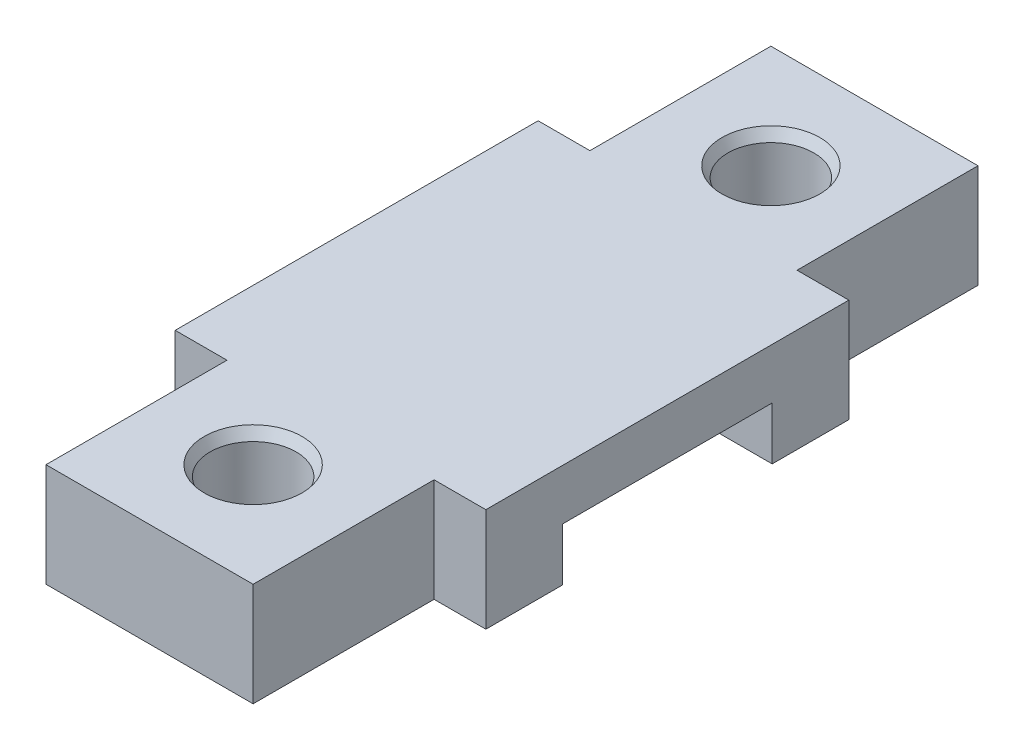
ISO-10303-21;
HEADER;
FILE_DESCRIPTION(('STEP AP214'),'2;1');
FILE_NAME('part.step','',(''),(''),'','','');
FILE_SCHEMA(('AUTOMOTIVE_DESIGN { 1 0 10303 214 1 1 1 1 }'));
ENDSEC;
DATA;
#1=APPLICATION_CONTEXT('core data for automotive mechanical design processes');
#2=APPLICATION_PROTOCOL_DEFINITION('international standard','automotive_design',2000,#1);
#3=PRODUCT_CONTEXT('',#1,'mechanical');
#4=PRODUCT('Part','Part','',(#3));
#5=PRODUCT_RELATED_PRODUCT_CATEGORY('part','',(#4));
#6=PRODUCT_DEFINITION_FORMATION('','',#4);
#7=PRODUCT_DEFINITION_CONTEXT('part definition',#1,'design');
#8=PRODUCT_DEFINITION('design','',#6,#7);
#9=PRODUCT_DEFINITION_SHAPE('','',#8);
#10=(LENGTH_UNIT() NAMED_UNIT(*) SI_UNIT(.MILLI.,.METRE.));
#11=(NAMED_UNIT(*) PLANE_ANGLE_UNIT() SI_UNIT($,.RADIAN.));
#12=(NAMED_UNIT(*) SI_UNIT($,.STERADIAN.) SOLID_ANGLE_UNIT());
#13=UNCERTAINTY_MEASURE_WITH_UNIT(LENGTH_MEASURE(1.E-05),#10,'distance_accuracy_value','');
#14=(GEOMETRIC_REPRESENTATION_CONTEXT(3) GLOBAL_UNCERTAINTY_ASSIGNED_CONTEXT((#13)) GLOBAL_UNIT_ASSIGNED_CONTEXT((#10,
#11,#12)) REPRESENTATION_CONTEXT('',''));
#15=CARTESIAN_POINT('',(0.,0.,0.));
#16=DIRECTION('',(0.,0.,1.));
#17=DIRECTION('',(1.,0.,0.));
#18=AXIS2_PLACEMENT_3D('',#15,#16,#17);
#19=CARTESIAN_POINT('',(-10.,10.,35.));
#20=DIRECTION('',(1.,0.,0.));
#21=DIRECTION('',(0.,0.,-1.));
#22=AXIS2_PLACEMENT_3D('',#19,#20,#21);
#23=PLANE('',#22);
#24=DIRECTION('',(0.,0.,1.));
#25=VECTOR('',#24,1.);
#26=CARTESIAN_POINT('',(-10.,10.,35.));
#27=LINE('',#26,#25);
#28=CARTESIAN_POINT('',(-10.,10.,17.525));
#29=VERTEX_POINT('',#28);
#30=CARTESIAN_POINT('',(-10.,10.,35.));
#31=VERTEX_POINT('',#30);
#32=EDGE_CURVE('E249',#29,#31,#27,.T.);
#33=ORIENTED_EDGE('',*,*,#32,.F.);
#34=DIRECTION('',(0.,-1.,0.));
#35=VECTOR('',#34,1.);
#36=CARTESIAN_POINT('',(-10.,10.,17.525));
#37=LINE('',#36,#35);
#38=CARTESIAN_POINT('',(-10.,0.,17.525));
#39=VERTEX_POINT('',#38);
#40=EDGE_CURVE('E50',#29,#39,#37,.T.);
#41=ORIENTED_EDGE('',*,*,#40,.T.);
#42=DIRECTION('',(0.,0.,1.));
#43=VECTOR('',#42,1.);
#44=CARTESIAN_POINT('',(-10.,0.,35.));
#45=LINE('',#44,#43);
#46=CARTESIAN_POINT('',(-10.,0.,35.));
#47=VERTEX_POINT('',#46);
#48=EDGE_CURVE('E159',#39,#47,#45,.T.);
#49=ORIENTED_EDGE('',*,*,#48,.T.);
#50=DIRECTION('',(0.,-1.,0.));
#51=VECTOR('',#50,1.);
#52=CARTESIAN_POINT('',(-10.,10.,35.));
#53=LINE('',#52,#51);
#54=EDGE_CURVE('E273',#31,#47,#53,.T.);
#55=ORIENTED_EDGE('',*,*,#54,.F.);
#56=EDGE_LOOP('',(#33,#41,#49,#55));
#57=FACE_BOUND('',#56,.T.);
#58=ADVANCED_FACE('F35',(#57),#23,.F.);
#59=CARTESIAN_POINT('',(9.99999999999999,10.,35.));
#60=DIRECTION('',(-1.,0.,0.));
#61=DIRECTION('',(0.,0.,1.));
#62=AXIS2_PLACEMENT_3D('',#59,#60,#61);
#63=PLANE('',#62);
#64=DIRECTION('',(0.,0.,-1.));
#65=VECTOR('',#64,1.);
#66=CARTESIAN_POINT('',(9.99999999999999,0.,35.));
#67=LINE('',#66,#65);
#68=CARTESIAN_POINT('',(9.99999999999999,0.,35.));
#69=VERTEX_POINT('',#68);
#70=CARTESIAN_POINT('',(9.99999999999999,0.,17.525));
#71=VERTEX_POINT('',#70);
#72=EDGE_CURVE('E58',#69,#71,#67,.T.);
#73=ORIENTED_EDGE('',*,*,#72,.T.);
#74=DIRECTION('',(0.,1.,0.));
#75=VECTOR('',#74,1.);
#76=CARTESIAN_POINT('',(9.99999999999999,10.,17.525));
#77=LINE('',#76,#75);
#78=CARTESIAN_POINT('',(9.99999999999999,10.,17.525));
#79=VERTEX_POINT('',#78);
#80=EDGE_CURVE('E231',#71,#79,#77,.T.);
#81=ORIENTED_EDGE('',*,*,#80,.T.);
#82=DIRECTION('',(0.,0.,-1.));
#83=VECTOR('',#82,1.);
#84=CARTESIAN_POINT('',(9.99999999999999,10.,35.));
#85=LINE('',#84,#83);
#86=CARTESIAN_POINT('',(9.99999999999999,10.,35.));
#87=VERTEX_POINT('',#86);
#88=EDGE_CURVE('E252',#87,#79,#85,.T.);
#89=ORIENTED_EDGE('',*,*,#88,.F.);
#90=DIRECTION('',(0.,-1.,0.));
#91=VECTOR('',#90,1.);
#92=CARTESIAN_POINT('',(9.99999999999999,10.,35.));
#93=LINE('',#92,#91);
#94=EDGE_CURVE('E271',#87,#69,#93,.T.);
#95=ORIENTED_EDGE('',*,*,#94,.T.);
#96=EDGE_LOOP('',(#73,#81,#89,#95));
#97=FACE_BOUND('',#96,.T.);
#98=ADVANCED_FACE('F345',(#97),#63,.F.);
#99=CARTESIAN_POINT('',(0.,0.,0.));
#100=DIRECTION('',(0.,1.,0.));
#101=DIRECTION('',(0.,0.,1.));
#102=AXIS2_PLACEMENT_3D('',#99,#100,#101);
#103=PLANE('',#102);
#104=CARTESIAN_POINT('',(0.,0.,25.));
#105=DIRECTION('',(0.,-1.,0.));
#106=DIRECTION('',(0.,0.,-1.));
#107=AXIS2_PLACEMENT_3D('',#104,#105,#106);
#108=CIRCLE('',#107,4.15);
#109=CARTESIAN_POINT('',(0.,0.,20.85));
#110=VERTEX_POINT('',#109);
#111=EDGE_CURVE('E237',#110,#110,#108,.T.);
#112=ORIENTED_EDGE('',*,*,#111,.F.);
#113=EDGE_LOOP('',(#112));
#114=FACE_BOUND('',#113,.T.);
#115=ORIENTED_EDGE('',*,*,#48,.F.);
#116=DIRECTION('',(1.,0.,0.));
#117=VECTOR('',#116,1.);
#118=CARTESIAN_POINT('',(-15.,0.,17.525));
#119=LINE('',#118,#117);
#120=CARTESIAN_POINT('',(-15.,0.,17.525));
#121=VERTEX_POINT('',#120);
#122=EDGE_CURVE('E212',#121,#39,#119,.T.);
#123=ORIENTED_EDGE('',*,*,#122,.F.);
#124=DIRECTION('',(0.,0.,-1.));
#125=VECTOR('',#124,1.);
#126=CARTESIAN_POINT('',(-15.,0.,10.125));
#127=LINE('',#126,#125);
#128=CARTESIAN_POINT('',(-15.,0.,10.125));
#129=VERTEX_POINT('',#128);
#130=EDGE_CURVE('E208',#121,#129,#127,.T.);
#131=ORIENTED_EDGE('',*,*,#130,.T.);
#132=DIRECTION('',(1.,0.,0.));
#133=VECTOR('',#132,1.);
#134=CARTESIAN_POINT('',(-10.,0.,10.125));
#135=LINE('',#134,#133);
#136=CARTESIAN_POINT('',(15.,0.,10.125));
#137=VERTEX_POINT('',#136);
#138=EDGE_CURVE('E239',#129,#137,#135,.T.);
#139=ORIENTED_EDGE('',*,*,#138,.T.);
#140=DIRECTION('',(0.,0.,-1.));
#141=VECTOR('',#140,1.);
#142=CARTESIAN_POINT('',(15.,0.,10.125));
#143=LINE('',#142,#141);
#144=CARTESIAN_POINT('',(15.,0.,17.525));
#145=VERTEX_POINT('',#144);
#146=EDGE_CURVE('E174',#145,#137,#143,.T.);
#147=ORIENTED_EDGE('',*,*,#146,.F.);
#148=EDGE_CURVE('E216',#71,#145,#119,.T.);
#149=ORIENTED_EDGE('',*,*,#148,.F.);
#150=ORIENTED_EDGE('',*,*,#72,.F.);
#151=DIRECTION('',(1.,0.,0.));
#152=VECTOR('',#151,1.);
#153=CARTESIAN_POINT('',(9.99999999999999,0.,35.));
#154=LINE('',#153,#152);
#155=EDGE_CURVE('E260',#47,#69,#154,.T.);
#156=ORIENTED_EDGE('',*,*,#155,.F.);
#157=EDGE_LOOP('',(#115,#123,#131,#139,#147,#149,#150,#156));
#158=FACE_BOUND('',#157,.T.);
#159=ADVANCED_FACE('F334',(#114,#158),#103,.F.);
#160=CARTESIAN_POINT('',(-10.,0.,-35.));
#161=VERTEX_POINT('',#160);
#162=CARTESIAN_POINT('',(-10.,0.,-17.525));
#163=VERTEX_POINT('',#162);
#164=EDGE_CURVE('E258',#161,#163,#45,.T.);
#165=ORIENTED_EDGE('',*,*,#164,.T.);
#166=DIRECTION('',(0.,1.,0.));
#167=VECTOR('',#166,1.);
#168=CARTESIAN_POINT('',(-10.,10.,-17.525));
#169=LINE('',#168,#167);
#170=CARTESIAN_POINT('',(-10.,10.,-17.525));
#171=VERTEX_POINT('',#170);
#172=EDGE_CURVE('E229',#163,#171,#169,.T.);
#173=ORIENTED_EDGE('',*,*,#172,.T.);
#174=CARTESIAN_POINT('',(-10.,10.,-35.));
#175=VERTEX_POINT('',#174);
#176=EDGE_CURVE('E245',#175,#171,#27,.T.);
#177=ORIENTED_EDGE('',*,*,#176,.F.);
#178=DIRECTION('',(0.,-1.,0.));
#179=VECTOR('',#178,1.);
#180=CARTESIAN_POINT('',(-10.,10.,-35.));
#181=LINE('',#180,#179);
#182=EDGE_CURVE('E257',#175,#161,#181,.T.);
#183=ORIENTED_EDGE('',*,*,#182,.T.);
#184=EDGE_LOOP('',(#165,#173,#177,#183));
#185=FACE_BOUND('',#184,.T.);
#186=ADVANCED_FACE('F354',(#185),#23,.F.);
#187=CARTESIAN_POINT('',(9.99999999999999,10.,35.));
#188=DIRECTION('',(0.,0.,-1.));
#189=DIRECTION('',(-1.,0.,0.));
#190=AXIS2_PLACEMENT_3D('',#187,#188,#189);
#191=PLANE('',#190);
#192=ORIENTED_EDGE('',*,*,#155,.T.);
#193=ORIENTED_EDGE('',*,*,#94,.F.);
#194=DIRECTION('',(1.,0.,0.));
#195=VECTOR('',#194,1.);
#196=CARTESIAN_POINT('',(9.99999999999999,10.,35.));
#197=LINE('',#196,#195);
#198=EDGE_CURVE('E248',#31,#87,#197,.T.);
#199=ORIENTED_EDGE('',*,*,#198,.F.);
#200=ORIENTED_EDGE('',*,*,#54,.T.);
#201=EDGE_LOOP('',(#192,#193,#199,#200));
#202=FACE_BOUND('',#201,.T.);
#203=ADVANCED_FACE('F342',(#202),#191,.F.);
#204=CARTESIAN_POINT('',(9.99999999999999,10.,-17.525));
#205=VERTEX_POINT('',#204);
#206=CARTESIAN_POINT('',(9.99999999999999,10.,-35.));
#207=VERTEX_POINT('',#206);
#208=EDGE_CURVE('E251',#205,#207,#85,.T.);
#209=ORIENTED_EDGE('',*,*,#208,.F.);
#210=DIRECTION('',(0.,-1.,0.));
#211=VECTOR('',#210,1.);
#212=CARTESIAN_POINT('',(9.99999999999999,10.,-17.525));
#213=LINE('',#212,#211);
#214=CARTESIAN_POINT('',(9.99999999999999,0.,-17.525));
#215=VERTEX_POINT('',#214);
#216=EDGE_CURVE('E215',#205,#215,#213,.T.);
#217=ORIENTED_EDGE('',*,*,#216,.T.);
#218=CARTESIAN_POINT('',(9.99999999999999,0.,-35.));
#219=VERTEX_POINT('',#218);
#220=EDGE_CURVE('E262',#215,#219,#67,.T.);
#221=ORIENTED_EDGE('',*,*,#220,.T.);
#222=DIRECTION('',(0.,-1.,0.));
#223=VECTOR('',#222,1.);
#224=CARTESIAN_POINT('',(9.99999999999999,10.,-35.));
#225=LINE('',#224,#223);
#226=EDGE_CURVE('E268',#207,#219,#225,.T.);
#227=ORIENTED_EDGE('',*,*,#226,.F.);
#228=EDGE_LOOP('',(#209,#217,#221,#227));
#229=FACE_BOUND('',#228,.T.);
#230=ADVANCED_FACE('F348',(#229),#63,.F.);
#231=CARTESIAN_POINT('',(9.99999999999999,10.,-35.));
#232=DIRECTION('',(0.,0.,1.));
#233=DIRECTION('',(1.,0.,0.));
#234=AXIS2_PLACEMENT_3D('',#231,#232,#233);
#235=PLANE('',#234);
#236=DIRECTION('',(-1.,0.,0.));
#237=VECTOR('',#236,1.);
#238=CARTESIAN_POINT('',(9.99999999999999,0.,-35.));
#239=LINE('',#238,#237);
#240=EDGE_CURVE('E264',#219,#161,#239,.T.);
#241=ORIENTED_EDGE('',*,*,#240,.T.);
#242=ORIENTED_EDGE('',*,*,#182,.F.);
#243=DIRECTION('',(-1.,0.,0.));
#244=VECTOR('',#243,1.);
#245=CARTESIAN_POINT('',(9.99999999999999,10.,-35.));
#246=LINE('',#245,#244);
#247=EDGE_CURVE('E255',#207,#175,#246,.T.);
#248=ORIENTED_EDGE('',*,*,#247,.F.);
#249=ORIENTED_EDGE('',*,*,#226,.T.);
#250=EDGE_LOOP('',(#241,#242,#248,#249));
#251=FACE_BOUND('',#250,.T.);
#252=ADVANCED_FACE('F297',(#251),#235,.F.);
#253=CARTESIAN_POINT('',(0.,10.,0.));
#254=DIRECTION('',(0.,1.,0.));
#255=DIRECTION('',(0.,0.,1.));
#256=AXIS2_PLACEMENT_3D('',#253,#254,#255);
#257=PLANE('',#256);
#258=CARTESIAN_POINT('',(0.,10.,-25.));
#259=DIRECTION('',(0.,1.,0.));
#260=DIRECTION('',(0.,0.,1.));
#261=AXIS2_PLACEMENT_3D('',#258,#259,#260);
#262=CIRCLE('',#261,4.72735026918962);
#263=CARTESIAN_POINT('',(0.,10.,-20.2726497308104));
#264=VERTEX_POINT('',#263);
#265=EDGE_CURVE('E279',#264,#264,#262,.F.);
#266=ORIENTED_EDGE('',*,*,#265,.T.);
#267=EDGE_LOOP('',(#266));
#268=FACE_BOUND('',#267,.T.);
#269=CARTESIAN_POINT('',(0.,10.,25.));
#270=DIRECTION('',(0.,1.,0.));
#271=DIRECTION('',(0.,0.,1.));
#272=AXIS2_PLACEMENT_3D('',#269,#270,#271);
#273=CIRCLE('',#272,4.72735026918962);
#274=CARTESIAN_POINT('',(0.,10.,29.7273502691896));
#275=VERTEX_POINT('',#274);
#276=EDGE_CURVE('E276',#275,#275,#273,.F.);
#277=ORIENTED_EDGE('',*,*,#276,.T.);
#278=EDGE_LOOP('',(#277));
#279=FACE_BOUND('',#278,.T.);
#280=ORIENTED_EDGE('',*,*,#176,.T.);
#281=DIRECTION('',(1.,0.,0.));
#282=VECTOR('',#281,1.);
#283=CARTESIAN_POINT('',(-15.,10.,-17.525));
#284=LINE('',#283,#282);
#285=CARTESIAN_POINT('',(-15.,10.,-17.525));
#286=VERTEX_POINT('',#285);
#287=EDGE_CURVE('E221',#286,#171,#284,.T.);
#288=ORIENTED_EDGE('',*,*,#287,.F.);
#289=DIRECTION('',(0.,0.,1.));
#290=VECTOR('',#289,1.);
#291=CARTESIAN_POINT('',(-15.,10.,17.525));
#292=LINE('',#291,#290);
#293=CARTESIAN_POINT('',(-15.,10.,17.525));
#294=VERTEX_POINT('',#293);
#295=EDGE_CURVE('E202',#286,#294,#292,.T.);
#296=ORIENTED_EDGE('',*,*,#295,.T.);
#297=DIRECTION('',(1.,0.,0.));
#298=VECTOR('',#297,1.);
#299=CARTESIAN_POINT('',(-15.,10.,17.525));
#300=LINE('',#299,#298);
#301=EDGE_CURVE('E217',#294,#29,#300,.T.);
#302=ORIENTED_EDGE('',*,*,#301,.T.);
#303=ORIENTED_EDGE('',*,*,#32,.T.);
#304=ORIENTED_EDGE('',*,*,#198,.T.);
#305=ORIENTED_EDGE('',*,*,#88,.T.);
#306=CARTESIAN_POINT('',(15.,10.,17.525));
#307=VERTEX_POINT('',#306);
#308=EDGE_CURVE('E220',#79,#307,#300,.T.);
#309=ORIENTED_EDGE('',*,*,#308,.T.);
#310=DIRECTION('',(0.,0.,1.));
#311=VECTOR('',#310,1.);
#312=CARTESIAN_POINT('',(15.,10.,17.525));
#313=LINE('',#312,#311);
#314=CARTESIAN_POINT('',(15.,10.,-17.525));
#315=VERTEX_POINT('',#314);
#316=EDGE_CURVE('E184',#315,#307,#313,.T.);
#317=ORIENTED_EDGE('',*,*,#316,.F.);
#318=EDGE_CURVE('E224',#205,#315,#284,.T.);
#319=ORIENTED_EDGE('',*,*,#318,.F.);
#320=ORIENTED_EDGE('',*,*,#208,.T.);
#321=ORIENTED_EDGE('',*,*,#247,.T.);
#322=EDGE_LOOP('',(#280,#288,#296,#302,#303,#304,#305,#309,#317,#319,#320,#321));
#323=FACE_BOUND('',#322,.T.);
#324=ADVANCED_FACE('F293',(#268,#279,#323),#257,.T.);
#325=CARTESIAN_POINT('',(0.,0.,-25.));
#326=DIRECTION('',(0.,-1.,0.));
#327=DIRECTION('',(0.,0.,-1.));
#328=AXIS2_PLACEMENT_3D('',#325,#326,#327);
#329=CIRCLE('',#328,4.15);
#330=CARTESIAN_POINT('',(0.,0.,-29.15));
#331=VERTEX_POINT('',#330);
#332=EDGE_CURVE('E234',#331,#331,#329,.T.);
#333=ORIENTED_EDGE('',*,*,#332,.F.);
#334=EDGE_LOOP('',(#333));
#335=FACE_BOUND('',#334,.T.);
#336=ORIENTED_EDGE('',*,*,#220,.F.);
#337=DIRECTION('',(1.,0.,0.));
#338=VECTOR('',#337,1.);
#339=CARTESIAN_POINT('',(-15.,0.,-17.525));
#340=LINE('',#339,#338);
#341=CARTESIAN_POINT('',(15.,0.,-17.525));
#342=VERTEX_POINT('',#341);
#343=EDGE_CURVE('E211',#215,#342,#340,.T.);
#344=ORIENTED_EDGE('',*,*,#343,.T.);
#345=DIRECTION('',(0.,0.,-1.));
#346=VECTOR('',#345,1.);
#347=CARTESIAN_POINT('',(15.,0.,-17.525));
#348=LINE('',#347,#346);
#349=CARTESIAN_POINT('',(15.,0.,-10.125));
#350=VERTEX_POINT('',#349);
#351=EDGE_CURVE('E178',#350,#342,#348,.T.);
#352=ORIENTED_EDGE('',*,*,#351,.F.);
#353=DIRECTION('',(1.,0.,0.));
#354=VECTOR('',#353,1.);
#355=CARTESIAN_POINT('',(-10.,0.,-10.125));
#356=LINE('',#355,#354);
#357=CARTESIAN_POINT('',(-15.,0.,-10.125));
#358=VERTEX_POINT('',#357);
#359=EDGE_CURVE('E242',#358,#350,#356,.T.);
#360=ORIENTED_EDGE('',*,*,#359,.F.);
#361=DIRECTION('',(0.,0.,-1.));
#362=VECTOR('',#361,1.);
#363=CARTESIAN_POINT('',(-15.,0.,-17.525));
#364=LINE('',#363,#362);
#365=CARTESIAN_POINT('',(-15.,0.,-17.525));
#366=VERTEX_POINT('',#365);
#367=EDGE_CURVE('E196',#358,#366,#364,.T.);
#368=ORIENTED_EDGE('',*,*,#367,.T.);
#369=EDGE_CURVE('E225',#366,#163,#340,.T.);
#370=ORIENTED_EDGE('',*,*,#369,.T.);
#371=ORIENTED_EDGE('',*,*,#164,.F.);
#372=ORIENTED_EDGE('',*,*,#240,.F.);
#373=EDGE_LOOP('',(#336,#344,#352,#360,#368,#370,#371,#372));
#374=FACE_BOUND('',#373,.T.);
#375=ADVANCED_FACE('F296',(#335,#374),#103,.F.);
#376=CARTESIAN_POINT('',(-10.,5.10000000000001,-10.125));
#377=DIRECTION('',(0.,1.,0.));
#378=DIRECTION('',(0.,0.,1.));
#379=AXIS2_PLACEMENT_3D('',#376,#377,#378);
#380=PLANE('',#379);
#381=DIRECTION('',(1.,0.,0.));
#382=VECTOR('',#381,1.);
#383=CARTESIAN_POINT('',(-10.,5.1,10.125));
#384=LINE('',#383,#382);
#385=CARTESIAN_POINT('',(-15.,5.1,10.125));
#386=VERTEX_POINT('',#385);
#387=CARTESIAN_POINT('',(15.,5.1,10.125));
#388=VERTEX_POINT('',#387);
#389=EDGE_CURVE('E149',#386,#388,#384,.T.);
#390=ORIENTED_EDGE('',*,*,#389,.F.);
#391=DIRECTION('',(0.,0.,-1.));
#392=VECTOR('',#391,1.);
#393=CARTESIAN_POINT('',(-15.,5.10000000000001,-10.125));
#394=LINE('',#393,#392);
#395=CARTESIAN_POINT('',(-15.,5.10000000000001,-10.125));
#396=VERTEX_POINT('',#395);
#397=EDGE_CURVE('E191',#386,#396,#394,.T.);
#398=ORIENTED_EDGE('',*,*,#397,.T.);
#399=DIRECTION('',(1.,0.,0.));
#400=VECTOR('',#399,1.);
#401=CARTESIAN_POINT('',(-10.,5.10000000000001,-10.125));
#402=LINE('',#401,#400);
#403=CARTESIAN_POINT('',(15.,5.10000000000001,-10.125));
#404=VERTEX_POINT('',#403);
#405=EDGE_CURVE('E160',#396,#404,#402,.T.);
#406=ORIENTED_EDGE('',*,*,#405,.T.);
#407=DIRECTION('',(0.,0.,-1.));
#408=VECTOR('',#407,1.);
#409=CARTESIAN_POINT('',(15.,5.10000000000001,-10.125));
#410=LINE('',#409,#408);
#411=EDGE_CURVE('E163',#388,#404,#410,.T.);
#412=ORIENTED_EDGE('',*,*,#411,.F.);
#413=EDGE_LOOP('',(#390,#398,#406,#412));
#414=FACE_BOUND('',#413,.T.);
#415=ADVANCED_FACE('F164',(#414),#380,.F.);
#416=CARTESIAN_POINT('',(-10.,5.1,10.125));
#417=DIRECTION('',(0.,0.,1.));
#418=DIRECTION('',(1.,0.,0.));
#419=AXIS2_PLACEMENT_3D('',#416,#417,#418);
#420=PLANE('',#419);
#421=ORIENTED_EDGE('',*,*,#138,.F.);
#422=DIRECTION('',(0.,1.,0.));
#423=VECTOR('',#422,1.);
#424=CARTESIAN_POINT('',(-15.,5.1,10.125));
#425=LINE('',#424,#423);
#426=EDGE_CURVE('E155',#129,#386,#425,.T.);
#427=ORIENTED_EDGE('',*,*,#426,.T.);
#428=ORIENTED_EDGE('',*,*,#389,.T.);
#429=DIRECTION('',(0.,1.,0.));
#430=VECTOR('',#429,1.);
#431=CARTESIAN_POINT('',(15.,5.1,10.125));
#432=LINE('',#431,#430);
#433=EDGE_CURVE('E153',#137,#388,#432,.T.);
#434=ORIENTED_EDGE('',*,*,#433,.F.);
#435=EDGE_LOOP('',(#421,#427,#428,#434));
#436=FACE_BOUND('',#435,.T.);
#437=ADVANCED_FACE('F151',(#436),#420,.F.);
#438=CARTESIAN_POINT('',(-10.,5.10000000000001,-10.125));
#439=DIRECTION('',(0.,0.,-1.));
#440=DIRECTION('',(0.,1.,0.));
#441=AXIS2_PLACEMENT_3D('',#438,#439,#440);
#442=PLANE('',#441);
#443=ORIENTED_EDGE('',*,*,#405,.F.);
#444=DIRECTION('',(0.,-1.,0.));
#445=VECTOR('',#444,1.);
#446=CARTESIAN_POINT('',(-15.,0.,-10.125));
#447=LINE('',#446,#445);
#448=EDGE_CURVE('E193',#396,#358,#447,.T.);
#449=ORIENTED_EDGE('',*,*,#448,.T.);
#450=ORIENTED_EDGE('',*,*,#359,.T.);
#451=DIRECTION('',(0.,-1.,0.));
#452=VECTOR('',#451,1.);
#453=CARTESIAN_POINT('',(15.,0.,-10.125));
#454=LINE('',#453,#452);
#455=EDGE_CURVE('E168',#404,#350,#454,.T.);
#456=ORIENTED_EDGE('',*,*,#455,.F.);
#457=EDGE_LOOP('',(#443,#449,#450,#456));
#458=FACE_BOUND('',#457,.T.);
#459=ADVANCED_FACE('F319',(#458),#442,.F.);
#460=CARTESIAN_POINT('',(0.,10.,25.));
#461=DIRECTION('',(0.,-1.,0.));
#462=DIRECTION('',(0.,0.,-1.));
#463=AXIS2_PLACEMENT_3D('',#460,#461,#462);
#464=CYLINDRICAL_SURFACE('',#463,4.15);
#465=CARTESIAN_POINT('',(0.,9.,25.));
#466=DIRECTION('',(0.,1.,0.));
#467=DIRECTION('',(0.,0.,1.));
#468=AXIS2_PLACEMENT_3D('',#465,#466,#467);
#469=CIRCLE('',#468,4.15);
#470=CARTESIAN_POINT('',(0.,9.,29.15));
#471=VERTEX_POINT('',#470);
#472=EDGE_CURVE('E11',#471,#471,#469,.T.);
#473=ORIENTED_EDGE('',*,*,#472,.T.);
#474=EDGE_LOOP('',(#473));
#475=FACE_BOUND('',#474,.T.);
#476=ORIENTED_EDGE('',*,*,#111,.T.);
#477=EDGE_LOOP('',(#476));
#478=FACE_BOUND('',#477,.T.);
#479=ADVANCED_FACE('F411',(#475,#478),#464,.F.);
#480=CARTESIAN_POINT('',(0.,10.,-25.));
#481=DIRECTION('',(0.,-1.,0.));
#482=DIRECTION('',(0.,0.,-1.));
#483=AXIS2_PLACEMENT_3D('',#480,#481,#482);
#484=CYLINDRICAL_SURFACE('',#483,4.15);
#485=CARTESIAN_POINT('',(0.,9.,-25.));
#486=DIRECTION('',(0.,1.,0.));
#487=DIRECTION('',(0.,0.,1.));
#488=AXIS2_PLACEMENT_3D('',#485,#486,#487);
#489=CIRCLE('',#488,4.15);
#490=CARTESIAN_POINT('',(0.,9.,-20.85));
#491=VERTEX_POINT('',#490);
#492=EDGE_CURVE('E43',#491,#491,#489,.T.);
#493=ORIENTED_EDGE('',*,*,#492,.T.);
#494=EDGE_LOOP('',(#493));
#495=FACE_BOUND('',#494,.T.);
#496=ORIENTED_EDGE('',*,*,#332,.T.);
#497=EDGE_LOOP('',(#496));
#498=FACE_BOUND('',#497,.T.);
#499=ADVANCED_FACE('F284',(#495,#498),#484,.F.);
#500=CARTESIAN_POINT('',(15.,0.,0.));
#501=DIRECTION('',(-1.,0.,0.));
#502=DIRECTION('',(0.,0.,1.));
#503=AXIS2_PLACEMENT_3D('',#500,#501,#502);
#504=PLANE('',#503);
#505=ORIENTED_EDGE('',*,*,#433,.T.);
#506=ORIENTED_EDGE('',*,*,#411,.T.);
#507=ORIENTED_EDGE('',*,*,#455,.T.);
#508=ORIENTED_EDGE('',*,*,#351,.T.);
#509=DIRECTION('',(0.,1.,0.));
#510=VECTOR('',#509,1.);
#511=CARTESIAN_POINT('',(15.,10.,-17.525));
#512=LINE('',#511,#510);
#513=EDGE_CURVE('E181',#342,#315,#512,.T.);
#514=ORIENTED_EDGE('',*,*,#513,.T.);
#515=ORIENTED_EDGE('',*,*,#316,.T.);
#516=DIRECTION('',(0.,-1.,0.));
#517=VECTOR('',#516,1.);
#518=CARTESIAN_POINT('',(15.,0.,17.525));
#519=LINE('',#518,#517);
#520=EDGE_CURVE('E187',#307,#145,#519,.T.);
#521=ORIENTED_EDGE('',*,*,#520,.T.);
#522=ORIENTED_EDGE('',*,*,#146,.T.);
#523=EDGE_LOOP('',(#505,#506,#507,#508,#514,#515,#521,#522));
#524=FACE_BOUND('',#523,.T.);
#525=ADVANCED_FACE('F171',(#524),#504,.F.);
#526=CARTESIAN_POINT('',(-15.,10.,-17.525));
#527=DIRECTION('',(0.,0.,-1.));
#528=DIRECTION('',(-1.,0.,0.));
#529=AXIS2_PLACEMENT_3D('',#526,#527,#528);
#530=PLANE('',#529);
#531=ORIENTED_EDGE('',*,*,#216,.F.);
#532=ORIENTED_EDGE('',*,*,#318,.T.);
#533=ORIENTED_EDGE('',*,*,#513,.F.);
#534=ORIENTED_EDGE('',*,*,#343,.F.);
#535=EDGE_LOOP('',(#531,#532,#533,#534));
#536=FACE_BOUND('',#535,.T.);
#537=ADVANCED_FACE('F325',(#536),#530,.T.);
#538=CARTESIAN_POINT('',(-15.,0.,17.525));
#539=DIRECTION('',(0.,0.,1.));
#540=DIRECTION('',(1.,0.,0.));
#541=AXIS2_PLACEMENT_3D('',#538,#539,#540);
#542=PLANE('',#541);
#543=ORIENTED_EDGE('',*,*,#80,.F.);
#544=ORIENTED_EDGE('',*,*,#148,.T.);
#545=ORIENTED_EDGE('',*,*,#520,.F.);
#546=ORIENTED_EDGE('',*,*,#308,.F.);
#547=EDGE_LOOP('',(#543,#544,#545,#546));
#548=FACE_BOUND('',#547,.T.);
#549=ADVANCED_FACE('F331',(#548),#542,.T.);
#550=ORIENTED_EDGE('',*,*,#40,.F.);
#551=ORIENTED_EDGE('',*,*,#301,.F.);
#552=DIRECTION('',(0.,-1.,0.));
#553=VECTOR('',#552,1.);
#554=CARTESIAN_POINT('',(-15.,0.,17.525));
#555=LINE('',#554,#553);
#556=EDGE_CURVE('E205',#294,#121,#555,.T.);
#557=ORIENTED_EDGE('',*,*,#556,.T.);
#558=ORIENTED_EDGE('',*,*,#122,.T.);
#559=EDGE_LOOP('',(#550,#551,#557,#558));
#560=FACE_BOUND('',#559,.T.);
#561=ADVANCED_FACE('F339',(#560),#542,.T.);
#562=ORIENTED_EDGE('',*,*,#172,.F.);
#563=ORIENTED_EDGE('',*,*,#369,.F.);
#564=DIRECTION('',(0.,1.,0.));
#565=VECTOR('',#564,1.);
#566=CARTESIAN_POINT('',(-15.,10.,-17.525));
#567=LINE('',#566,#565);
#568=EDGE_CURVE('E199',#366,#286,#567,.T.);
#569=ORIENTED_EDGE('',*,*,#568,.T.);
#570=ORIENTED_EDGE('',*,*,#287,.T.);
#571=EDGE_LOOP('',(#562,#563,#569,#570));
#572=FACE_BOUND('',#571,.T.);
#573=ADVANCED_FACE('F308',(#572),#530,.T.);
#574=CARTESIAN_POINT('',(-15.,0.,0.));
#575=DIRECTION('',(-1.,0.,0.));
#576=DIRECTION('',(0.,0.,1.));
#577=AXIS2_PLACEMENT_3D('',#574,#575,#576);
#578=PLANE('',#577);
#579=ORIENTED_EDGE('',*,*,#426,.F.);
#580=ORIENTED_EDGE('',*,*,#130,.F.);
#581=ORIENTED_EDGE('',*,*,#556,.F.);
#582=ORIENTED_EDGE('',*,*,#295,.F.);
#583=ORIENTED_EDGE('',*,*,#568,.F.);
#584=ORIENTED_EDGE('',*,*,#367,.F.);
#585=ORIENTED_EDGE('',*,*,#448,.F.);
#586=ORIENTED_EDGE('',*,*,#397,.F.);
#587=EDGE_LOOP('',(#579,#580,#581,#582,#583,#584,#585,#586));
#588=FACE_BOUND('',#587,.T.);
#589=ADVANCED_FACE('F290',(#588),#578,.T.);
#590=CARTESIAN_POINT('',(0.,10.,-25.));
#591=DIRECTION('',(0.,1.,0.));
#592=DIRECTION('',(0.,0.,1.));
#593=AXIS2_PLACEMENT_3D('',#590,#591,#592);
#594=CONICAL_SURFACE('',#593,4.72735026918962,0.523598775598294);
#595=ORIENTED_EDGE('',*,*,#492,.F.);
#596=EDGE_LOOP('',(#595));
#597=FACE_BOUND('',#596,.T.);
#598=ORIENTED_EDGE('',*,*,#265,.F.);
#599=EDGE_LOOP('',(#598));
#600=FACE_BOUND('',#599,.T.);
#601=ADVANCED_FACE('F287',(#597,#600),#594,.F.);
#602=CARTESIAN_POINT('',(0.,10.,25.));
#603=DIRECTION('',(0.,1.,0.));
#604=DIRECTION('',(0.,0.,1.));
#605=AXIS2_PLACEMENT_3D('',#602,#603,#604);
#606=CONICAL_SURFACE('',#605,4.72735026918962,0.523598775598294);
#607=ORIENTED_EDGE('',*,*,#472,.F.);
#608=EDGE_LOOP('',(#607));
#609=FACE_BOUND('',#608,.T.);
#610=ORIENTED_EDGE('',*,*,#276,.F.);
#611=EDGE_LOOP('',(#610));
#612=FACE_BOUND('',#611,.T.);
#613=ADVANCED_FACE('F37',(#609,#612),#606,.F.);
#614=CLOSED_SHELL('',(#58,#98,#159,#186,#203,#230,#252,#324,#375,#415,#437,#459,#479,#499,#525,
#537,#549,#561,#573,#589,#601,#613));
#615=MANIFOLD_SOLID_BREP('B2',#614);
#616=ADVANCED_BREP_SHAPE_REPRESENTATION('',(#18,#615),#14);
#617=SHAPE_DEFINITION_REPRESENTATION(#9,#616);
ENDSEC;
END-ISO-10303-21;
